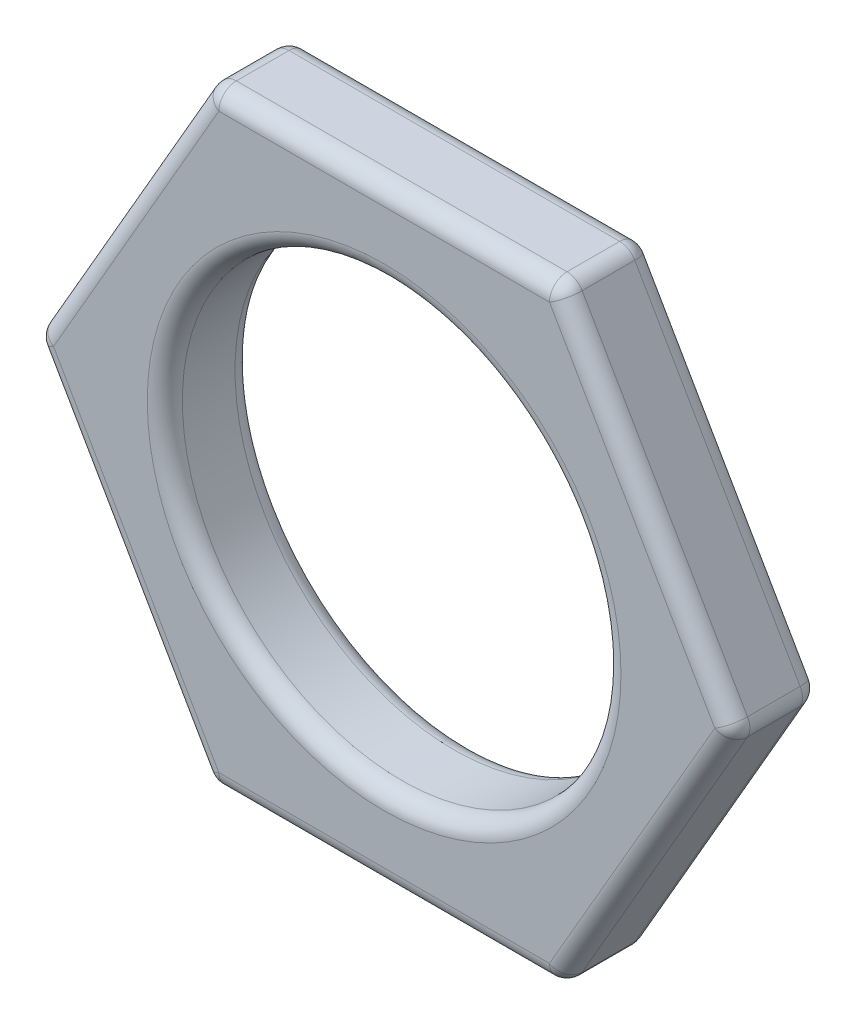
ISO-10303-21;
HEADER;
FILE_DESCRIPTION(('STEP AP214'),'2;1');
FILE_NAME('part.step','',(''),(''),'','','');
FILE_SCHEMA(('AUTOMOTIVE_DESIGN { 1 0 10303 214 1 1 1 1 }'));
ENDSEC;
DATA;
#1=APPLICATION_CONTEXT('core data for automotive mechanical design processes');
#2=APPLICATION_PROTOCOL_DEFINITION('international standard','automotive_design',2000,#1);
#3=PRODUCT_CONTEXT('',#1,'mechanical');
#4=PRODUCT('Part','Part','',(#3));
#5=PRODUCT_RELATED_PRODUCT_CATEGORY('part','',(#4));
#6=PRODUCT_DEFINITION_FORMATION('','',#4);
#7=PRODUCT_DEFINITION_CONTEXT('part definition',#1,'design');
#8=PRODUCT_DEFINITION('design','',#6,#7);
#9=PRODUCT_DEFINITION_SHAPE('','',#8);
#10=(LENGTH_UNIT() NAMED_UNIT(*) SI_UNIT(.MILLI.,.METRE.));
#11=(NAMED_UNIT(*) PLANE_ANGLE_UNIT() SI_UNIT($,.RADIAN.));
#12=(NAMED_UNIT(*) SI_UNIT($,.STERADIAN.) SOLID_ANGLE_UNIT());
#13=UNCERTAINTY_MEASURE_WITH_UNIT(LENGTH_MEASURE(1.E-05),#10,'distance_accuracy_value','');
#14=(GEOMETRIC_REPRESENTATION_CONTEXT(3) GLOBAL_UNCERTAINTY_ASSIGNED_CONTEXT((#13)) GLOBAL_UNIT_ASSIGNED_CONTEXT((#10,
#11,#12)) REPRESENTATION_CONTEXT('',''));
#15=CARTESIAN_POINT('',(0.,0.,0.));
#16=DIRECTION('',(0.,0.,1.));
#17=DIRECTION('',(1.,0.,0.));
#18=AXIS2_PLACEMENT_3D('',#15,#16,#17);
#19=CARTESIAN_POINT('',(9.525,5.4992613140312,1.5875));
#20=DIRECTION('',(0.,0.,1.));
#21=DIRECTION('',(1.,0.,0.));
#22=AXIS2_PLACEMENT_3D('',#19,#20,#21);
#23=PLANE('',#22);
#24=CARTESIAN_POINT('',(0.,0.,1.5875));
#25=DIRECTION('',(0.,0.,1.));
#26=DIRECTION('',(1.,0.,0.));
#27=AXIS2_PLACEMENT_3D('',#24,#25,#26);
#28=CIRCLE('',#27,4.28625);
#29=CARTESIAN_POINT('',(4.28625,0.,1.5875));
#30=VERTEX_POINT('',#29);
#31=EDGE_CURVE('E11',#30,#30,#28,.F.);
#32=ORIENTED_EDGE('',*,*,#31,.T.);
#33=EDGE_LOOP('',(#32));
#34=FACE_BOUND('',#33,.T.);
#35=DIRECTION('',(0.500000000000001,-0.866025403784438,0.));
#36=VECTOR('',#35,1.);
#37=CARTESIAN_POINT('',(-2.90003693429844,-5.34051131403119,1.5875));
#38=LINE('',#37,#36);
#39=CARTESIAN_POINT('',(-5.9833825790646,0.,1.5875));
#40=VERTEX_POINT('',#39);
#41=CARTESIAN_POINT('',(-2.99169128953229,-5.18176131403119,1.5875));
#42=VERTEX_POINT('',#41);
#43=EDGE_CURVE('E53',#40,#42,#38,.T.);
#44=ORIENTED_EDGE('',*,*,#43,.T.);
#45=DIRECTION('',(1.,0.,0.));
#46=VECTOR('',#45,1.);
#47=CARTESIAN_POINT('',(3.17500000000001,-5.18176131403119,1.5875));
#48=LINE('',#47,#46);
#49=CARTESIAN_POINT('',(2.9916912895323,-5.18176131403119,1.5875));
#50=VERTEX_POINT('',#49);
#51=EDGE_CURVE('E45',#42,#50,#48,.T.);
#52=ORIENTED_EDGE('',*,*,#51,.T.);
#53=DIRECTION('',(0.499999999999999,0.866025403784439,0.));
#54=VECTOR('',#53,1.);
#55=CARTESIAN_POINT('',(6.07503693429845,0.158750000000013,1.5875));
#56=LINE('',#55,#54);
#57=CARTESIAN_POINT('',(5.9833825790646,0.,1.5875));
#58=VERTEX_POINT('',#57);
#59=EDGE_CURVE('E271',#50,#58,#56,.T.);
#60=ORIENTED_EDGE('',*,*,#59,.T.);
#61=DIRECTION('',(-0.500000000000002,0.866025403784438,0.));
#62=VECTOR('',#61,1.);
#63=CARTESIAN_POINT('',(2.90003693429844,5.3405113140312,1.5875));
#64=LINE('',#63,#62);
#65=CARTESIAN_POINT('',(2.99169128953229,5.1817613140312,1.5875));
#66=VERTEX_POINT('',#65);
#67=EDGE_CURVE('E273',#58,#66,#64,.T.);
#68=ORIENTED_EDGE('',*,*,#67,.T.);
#69=DIRECTION('',(-1.,0.,0.));
#70=VECTOR('',#69,1.);
#71=CARTESIAN_POINT('',(-3.175,5.1817613140312,1.5875));
#72=LINE('',#71,#70);
#73=CARTESIAN_POINT('',(-2.9916912895323,5.1817613140312,1.5875));
#74=VERTEX_POINT('',#73);
#75=EDGE_CURVE('E275',#66,#74,#72,.T.);
#76=ORIENTED_EDGE('',*,*,#75,.T.);
#77=DIRECTION('',(-0.500000000000001,-0.866025403784438,0.));
#78=VECTOR('',#77,1.);
#79=CARTESIAN_POINT('',(-6.07503693429845,-0.158749999999994,1.5875));
#80=LINE('',#79,#78);
#81=EDGE_CURVE('E58',#74,#40,#80,.T.);
#82=ORIENTED_EDGE('',*,*,#81,.T.);
#83=EDGE_LOOP('',(#44,#52,#60,#68,#76,#82));
#84=FACE_BOUND('',#83,.T.);
#85=ADVANCED_FACE('F36',(#34,#84),#23,.T.);
#86=CARTESIAN_POINT('',(9.525,5.4992613140312,0.));
#87=DIRECTION('',(0.,0.,1.));
#88=DIRECTION('',(1.,0.,0.));
#89=AXIS2_PLACEMENT_3D('',#86,#87,#88);
#90=PLANE('',#89);
#91=CARTESIAN_POINT('',(0.,0.,0.));
#92=DIRECTION('',(0.,0.,1.));
#93=DIRECTION('',(1.,0.,0.));
#94=AXIS2_PLACEMENT_3D('',#91,#92,#93);
#95=CIRCLE('',#94,4.28625);
#96=CARTESIAN_POINT('',(4.28625,0.,0.));
#97=VERTEX_POINT('',#96);
#98=EDGE_CURVE('E262',#97,#97,#95,.T.);
#99=ORIENTED_EDGE('',*,*,#98,.T.);
#100=EDGE_LOOP('',(#99));
#101=FACE_BOUND('',#100,.T.);
#102=DIRECTION('',(-1.,0.,0.));
#103=VECTOR('',#102,1.);
#104=CARTESIAN_POINT('',(9.525,5.1817613140312,0.));
#105=LINE('',#104,#103);
#106=CARTESIAN_POINT('',(-2.99169128953229,5.1817613140312,0.));
#107=VERTEX_POINT('',#106);
#108=CARTESIAN_POINT('',(2.99169128953229,5.1817613140312,0.));
#109=VERTEX_POINT('',#108);
#110=EDGE_CURVE('E257',#107,#109,#105,.F.);
#111=ORIENTED_EDGE('',*,*,#110,.T.);
#112=DIRECTION('',(-0.500000000000002,0.866025403784438,0.));
#113=VECTOR('',#112,1.);
#114=CARTESIAN_POINT('',(4.48753693429845,2.5908806570156,0.));
#115=LINE('',#114,#113);
#116=CARTESIAN_POINT('',(5.9833825790646,0.,0.));
#117=VERTEX_POINT('',#116);
#118=EDGE_CURVE('E259',#109,#117,#115,.F.);
#119=ORIENTED_EDGE('',*,*,#118,.T.);
#120=DIRECTION('',(0.499999999999999,0.866025403784439,0.));
#121=VECTOR('',#120,1.);
#122=CARTESIAN_POINT('',(9.25003693429844,5.65801131403119,0.));
#123=LINE('',#122,#121);
#124=CARTESIAN_POINT('',(2.9916912895323,-5.18176131403119,0.));
#125=VERTEX_POINT('',#124);
#126=EDGE_CURVE('E249',#117,#125,#123,.F.);
#127=ORIENTED_EDGE('',*,*,#126,.T.);
#128=DIRECTION('',(1.,0.,0.));
#129=VECTOR('',#128,1.);
#130=CARTESIAN_POINT('',(9.525,-5.18176131403119,0.));
#131=LINE('',#130,#129);
#132=CARTESIAN_POINT('',(-2.99169128953229,-5.18176131403119,0.));
#133=VERTEX_POINT('',#132);
#134=EDGE_CURVE('E251',#125,#133,#131,.F.);
#135=ORIENTED_EDGE('',*,*,#134,.T.);
#136=DIRECTION('',(0.500000000000001,-0.866025403784438,0.));
#137=VECTOR('',#136,1.);
#138=CARTESIAN_POINT('',(-4.48753693429844,-2.5908806570156,0.));
#139=LINE('',#138,#137);
#140=CARTESIAN_POINT('',(-5.9833825790646,0.,0.));
#141=VERTEX_POINT('',#140);
#142=EDGE_CURVE('E253',#133,#141,#139,.F.);
#143=ORIENTED_EDGE('',*,*,#142,.T.);
#144=DIRECTION('',(-0.500000000000001,-0.866025403784438,0.));
#145=VECTOR('',#144,1.);
#146=CARTESIAN_POINT('',(0.274963065701565,10.8397726280624,0.));
#147=LINE('',#146,#145);
#148=EDGE_CURVE('E255',#141,#107,#147,.F.);
#149=ORIENTED_EDGE('',*,*,#148,.T.);
#150=EDGE_LOOP('',(#111,#119,#127,#135,#143,#149));
#151=FACE_BOUND('',#150,.T.);
#152=ADVANCED_FACE('F378',(#101,#151),#90,.F.);
#153=CARTESIAN_POINT('',(3.17500000000001,-5.49926131403119,1.5875));
#154=DIRECTION('',(-0.866025403784439,0.499999999999999,0.));
#155=DIRECTION('',(-0.499999999999999,-0.866025403784439,0.));
#156=AXIS2_PLACEMENT_3D('',#153,#154,#155);
#157=PLANE('',#156);
#158=DIRECTION('',(0.,0.,-1.));
#159=VECTOR('',#158,1.);
#160=CARTESIAN_POINT('',(3.26665435523386,-5.34051131403119,1.5875));
#161=LINE('',#160,#159);
#162=CARTESIAN_POINT('',(3.26665435523386,-5.34051131403119,1.27));
#163=VERTEX_POINT('',#162);
#164=CARTESIAN_POINT('',(3.26665435523386,-5.34051131403119,0.3175));
#165=VERTEX_POINT('',#164);
#166=EDGE_CURVE('E174',#163,#165,#161,.T.);
#167=ORIENTED_EDGE('',*,*,#166,.T.);
#168=DIRECTION('',(0.499999999999999,0.866025403784439,0.));
#169=VECTOR('',#168,1.);
#170=CARTESIAN_POINT('',(3.17500000000001,-5.49926131403119,0.3175));
#171=LINE('',#170,#169);
#172=CARTESIAN_POINT('',(6.25834564476615,-0.158749999999987,0.3175));
#173=VERTEX_POINT('',#172);
#174=EDGE_CURVE('E170',#165,#173,#171,.T.);
#175=ORIENTED_EDGE('',*,*,#174,.T.);
#176=DIRECTION('',(0.,0.,-1.));
#177=VECTOR('',#176,1.);
#178=CARTESIAN_POINT('',(6.25834564476616,-0.158749999999987,1.5875));
#179=LINE('',#178,#177);
#180=CARTESIAN_POINT('',(6.25834564476615,-0.158749999999987,1.27));
#181=VERTEX_POINT('',#180);
#182=EDGE_CURVE('E162',#173,#181,#179,.F.);
#183=ORIENTED_EDGE('',*,*,#182,.T.);
#184=DIRECTION('',(0.499999999999999,0.866025403784439,0.));
#185=VECTOR('',#184,1.);
#186=CARTESIAN_POINT('',(3.17500000000001,-5.49926131403119,1.27));
#187=LINE('',#186,#185);
#188=EDGE_CURVE('E167',#181,#163,#187,.F.);
#189=ORIENTED_EDGE('',*,*,#188,.T.);
#190=EDGE_LOOP('',(#167,#175,#183,#189));
#191=FACE_BOUND('',#190,.T.);
#192=ADVANCED_FACE('F165',(#191),#157,.F.);
#193=CARTESIAN_POINT('',(6.35000000000001,0.,1.5875));
#194=DIRECTION('',(-0.866025403784438,-0.500000000000002,0.));
#195=DIRECTION('',(0.500000000000002,-0.866025403784438,0.));
#196=AXIS2_PLACEMENT_3D('',#193,#194,#195);
#197=PLANE('',#196);
#198=DIRECTION('',(0.,0.,-1.));
#199=VECTOR('',#198,1.);
#200=CARTESIAN_POINT('',(6.25834564476615,0.158750000000013,1.5875));
#201=LINE('',#200,#199);
#202=CARTESIAN_POINT('',(6.25834564476615,0.158750000000013,1.27));
#203=VERTEX_POINT('',#202);
#204=CARTESIAN_POINT('',(6.25834564476615,0.158750000000013,0.3175));
#205=VERTEX_POINT('',#204);
#206=EDGE_CURVE('E182',#203,#205,#201,.T.);
#207=ORIENTED_EDGE('',*,*,#206,.T.);
#208=DIRECTION('',(-0.500000000000002,0.866025403784438,0.));
#209=VECTOR('',#208,1.);
#210=CARTESIAN_POINT('',(6.35000000000001,0.,0.3175));
#211=LINE('',#210,#209);
#212=CARTESIAN_POINT('',(3.26665435523385,5.3405113140312,0.3175));
#213=VERTEX_POINT('',#212);
#214=EDGE_CURVE('E220',#205,#213,#211,.T.);
#215=ORIENTED_EDGE('',*,*,#214,.T.);
#216=DIRECTION('',(0.,0.,-1.));
#217=VECTOR('',#216,1.);
#218=CARTESIAN_POINT('',(3.26665435523385,5.3405113140312,1.5875));
#219=LINE('',#218,#217);
#220=CARTESIAN_POINT('',(3.26665435523385,5.3405113140312,1.27));
#221=VERTEX_POINT('',#220);
#222=EDGE_CURVE('E217',#213,#221,#219,.F.);
#223=ORIENTED_EDGE('',*,*,#222,.T.);
#224=DIRECTION('',(-0.500000000000002,0.866025403784438,0.));
#225=VECTOR('',#224,1.);
#226=CARTESIAN_POINT('',(6.35000000000001,0.,1.27));
#227=LINE('',#226,#225);
#228=EDGE_CURVE('E215',#221,#203,#227,.F.);
#229=ORIENTED_EDGE('',*,*,#228,.T.);
#230=EDGE_LOOP('',(#207,#215,#223,#229));
#231=FACE_BOUND('',#230,.T.);
#232=ADVANCED_FACE('F483',(#231),#197,.F.);
#233=CARTESIAN_POINT('',(3.175,5.4992613140312,1.5875));
#234=DIRECTION('',(0.,-1.,0.));
#235=DIRECTION('',(0.,0.,-1.));
#236=AXIS2_PLACEMENT_3D('',#233,#234,#235);
#237=PLANE('',#236);
#238=DIRECTION('',(0.,0.,-1.));
#239=VECTOR('',#238,1.);
#240=CARTESIAN_POINT('',(2.99169128953229,5.4992613140312,1.5875));
#241=LINE('',#240,#239);
#242=CARTESIAN_POINT('',(2.99169128953229,5.4992613140312,1.27));
#243=VERTEX_POINT('',#242);
#244=CARTESIAN_POINT('',(2.99169128953229,5.4992613140312,0.3175));
#245=VERTEX_POINT('',#244);
#246=EDGE_CURVE('E226',#243,#245,#241,.T.);
#247=ORIENTED_EDGE('',*,*,#246,.T.);
#248=DIRECTION('',(-1.,0.,0.));
#249=VECTOR('',#248,1.);
#250=CARTESIAN_POINT('',(3.175,5.4992613140312,0.3175));
#251=LINE('',#250,#249);
#252=CARTESIAN_POINT('',(-2.99169128953229,5.4992613140312,0.3175));
#253=VERTEX_POINT('',#252);
#254=EDGE_CURVE('E229',#245,#253,#251,.T.);
#255=ORIENTED_EDGE('',*,*,#254,.T.);
#256=DIRECTION('',(0.,0.,-1.));
#257=VECTOR('',#256,1.);
#258=CARTESIAN_POINT('',(-2.9916912895323,5.4992613140312,1.5875));
#259=LINE('',#258,#257);
#260=CARTESIAN_POINT('',(-2.99169128953229,5.4992613140312,1.27));
#261=VERTEX_POINT('',#260);
#262=EDGE_CURVE('E224',#253,#261,#259,.F.);
#263=ORIENTED_EDGE('',*,*,#262,.T.);
#264=DIRECTION('',(-1.,0.,0.));
#265=VECTOR('',#264,1.);
#266=CARTESIAN_POINT('',(3.175,5.4992613140312,1.27));
#267=LINE('',#266,#265);
#268=EDGE_CURVE('E222',#261,#243,#267,.F.);
#269=ORIENTED_EDGE('',*,*,#268,.T.);
#270=EDGE_LOOP('',(#247,#255,#263,#269));
#271=FACE_BOUND('',#270,.T.);
#272=ADVANCED_FACE('F413',(#271),#237,.F.);
#273=CARTESIAN_POINT('',(-3.175,5.4992613140312,1.5875));
#274=DIRECTION('',(0.866025403784438,-0.500000000000001,0.));
#275=DIRECTION('',(0.500000000000001,0.866025403784438,0.));
#276=AXIS2_PLACEMENT_3D('',#273,#274,#275);
#277=PLANE('',#276);
#278=DIRECTION('',(0.,0.,-1.));
#279=VECTOR('',#278,1.);
#280=CARTESIAN_POINT('',(-3.26665435523385,5.3405113140312,1.5875));
#281=LINE('',#280,#279);
#282=CARTESIAN_POINT('',(-3.26665435523385,5.3405113140312,1.27));
#283=VERTEX_POINT('',#282);
#284=CARTESIAN_POINT('',(-3.26665435523385,5.3405113140312,0.3175));
#285=VERTEX_POINT('',#284);
#286=EDGE_CURVE('E244',#283,#285,#281,.T.);
#287=ORIENTED_EDGE('',*,*,#286,.T.);
#288=DIRECTION('',(-0.500000000000001,-0.866025403784438,0.));
#289=VECTOR('',#288,1.);
#290=CARTESIAN_POINT('',(-3.175,5.4992613140312,0.3175));
#291=LINE('',#290,#289);
#292=CARTESIAN_POINT('',(-6.25834564476616,0.158750000000006,0.3175));
#293=VERTEX_POINT('',#292);
#294=EDGE_CURVE('E247',#285,#293,#291,.T.);
#295=ORIENTED_EDGE('',*,*,#294,.T.);
#296=DIRECTION('',(0.,0.,-1.));
#297=VECTOR('',#296,1.);
#298=CARTESIAN_POINT('',(-6.25834564476616,0.158750000000006,1.5875));
#299=LINE('',#298,#297);
#300=CARTESIAN_POINT('',(-6.25834564476616,0.158750000000006,1.27));
#301=VERTEX_POINT('',#300);
#302=EDGE_CURVE('E242',#293,#301,#299,.F.);
#303=ORIENTED_EDGE('',*,*,#302,.T.);
#304=DIRECTION('',(-0.500000000000001,-0.866025403784438,0.));
#305=VECTOR('',#304,1.);
#306=CARTESIAN_POINT('',(-3.175,5.4992613140312,1.27));
#307=LINE('',#306,#305);
#308=EDGE_CURVE('E240',#301,#283,#307,.F.);
#309=ORIENTED_EDGE('',*,*,#308,.T.);
#310=EDGE_LOOP('',(#287,#295,#303,#309));
#311=FACE_BOUND('',#310,.T.);
#312=ADVANCED_FACE('F387',(#311),#277,.F.);
#313=CARTESIAN_POINT('',(-6.35000000000001,0.,1.5875));
#314=DIRECTION('',(0.866025403784438,0.500000000000001,0.));
#315=DIRECTION('',(-0.500000000000001,0.866025403784438,0.));
#316=AXIS2_PLACEMENT_3D('',#313,#314,#315);
#317=PLANE('',#316);
#318=DIRECTION('',(0.,0.,-1.));
#319=VECTOR('',#318,1.);
#320=CARTESIAN_POINT('',(-6.25834564476616,-0.158749999999993,1.5875));
#321=LINE('',#320,#319);
#322=CARTESIAN_POINT('',(-6.25834564476616,-0.158749999999993,1.27));
#323=VERTEX_POINT('',#322);
#324=CARTESIAN_POINT('',(-6.25834564476616,-0.158749999999993,0.3175));
#325=VERTEX_POINT('',#324);
#326=EDGE_CURVE('E233',#323,#325,#321,.T.);
#327=ORIENTED_EDGE('',*,*,#326,.T.);
#328=DIRECTION('',(0.500000000000001,-0.866025403784438,0.));
#329=VECTOR('',#328,1.);
#330=CARTESIAN_POINT('',(-6.35000000000001,0.,0.3175));
#331=LINE('',#330,#329);
#332=CARTESIAN_POINT('',(-3.26665435523385,-5.34051131403119,0.3175));
#333=VERTEX_POINT('',#332);
#334=EDGE_CURVE('E238',#325,#333,#331,.T.);
#335=ORIENTED_EDGE('',*,*,#334,.T.);
#336=DIRECTION('',(0.,0.,-1.));
#337=VECTOR('',#336,1.);
#338=CARTESIAN_POINT('',(-3.26665435523385,-5.34051131403119,1.5875));
#339=LINE('',#338,#337);
#340=CARTESIAN_POINT('',(-3.26665435523385,-5.34051131403119,1.27));
#341=VERTEX_POINT('',#340);
#342=EDGE_CURVE('E235',#333,#341,#339,.F.);
#343=ORIENTED_EDGE('',*,*,#342,.T.);
#344=DIRECTION('',(0.500000000000001,-0.866025403784438,0.));
#345=VECTOR('',#344,1.);
#346=CARTESIAN_POINT('',(-6.35000000000001,0.,1.27));
#347=LINE('',#346,#345);
#348=EDGE_CURVE('E231',#341,#323,#347,.F.);
#349=ORIENTED_EDGE('',*,*,#348,.T.);
#350=EDGE_LOOP('',(#327,#335,#343,#349));
#351=FACE_BOUND('',#350,.T.);
#352=ADVANCED_FACE('F474',(#351),#317,.F.);
#353=CARTESIAN_POINT('',(-3.175,-5.49926131403119,1.5875));
#354=DIRECTION('',(0.,1.,0.));
#355=DIRECTION('',(0.,0.,1.));
#356=AXIS2_PLACEMENT_3D('',#353,#354,#355);
#357=PLANE('',#356);
#358=DIRECTION('',(0.,0.,-1.));
#359=VECTOR('',#358,1.);
#360=CARTESIAN_POINT('',(-2.99169128953229,-5.49926131403119,1.5875));
#361=LINE('',#360,#359);
#362=CARTESIAN_POINT('',(-2.99169128953229,-5.49926131403119,1.27));
#363=VERTEX_POINT('',#362);
#364=CARTESIAN_POINT('',(-2.99169128953229,-5.49926131403119,0.3175));
#365=VERTEX_POINT('',#364);
#366=EDGE_CURVE('E208',#363,#365,#361,.T.);
#367=ORIENTED_EDGE('',*,*,#366,.T.);
#368=DIRECTION('',(1.,0.,0.));
#369=VECTOR('',#368,1.);
#370=CARTESIAN_POINT('',(-3.175,-5.49926131403119,0.3175));
#371=LINE('',#370,#369);
#372=CARTESIAN_POINT('',(2.9916912895323,-5.49926131403119,0.3175));
#373=VERTEX_POINT('',#372);
#374=EDGE_CURVE('E213',#365,#373,#371,.T.);
#375=ORIENTED_EDGE('',*,*,#374,.T.);
#376=DIRECTION('',(0.,0.,-1.));
#377=VECTOR('',#376,1.);
#378=CARTESIAN_POINT('',(2.9916912895323,-5.49926131403119,1.5875));
#379=LINE('',#378,#377);
#380=CARTESIAN_POINT('',(2.9916912895323,-5.49926131403119,1.27));
#381=VERTEX_POINT('',#380);
#382=EDGE_CURVE('E210',#373,#381,#379,.F.);
#383=ORIENTED_EDGE('',*,*,#382,.T.);
#384=DIRECTION('',(1.,0.,0.));
#385=VECTOR('',#384,1.);
#386=CARTESIAN_POINT('',(-3.175,-5.49926131403119,1.27));
#387=LINE('',#386,#385);
#388=EDGE_CURVE('E206',#381,#363,#387,.F.);
#389=ORIENTED_EDGE('',*,*,#388,.T.);
#390=EDGE_LOOP('',(#367,#375,#383,#389));
#391=FACE_BOUND('',#390,.T.);
#392=ADVANCED_FACE('F471',(#391),#357,.F.);
#393=CARTESIAN_POINT('',(0.,0.,1.5875));
#394=DIRECTION('',(0.,0.,-1.));
#395=DIRECTION('',(-1.,0.,0.));
#396=AXIS2_PLACEMENT_3D('',#393,#394,#395);
#397=CYLINDRICAL_SURFACE('',#396,3.96875);
#398=CARTESIAN_POINT('',(0.,0.,0.3175));
#399=DIRECTION('',(0.,0.,1.));
#400=DIRECTION('',(1.,0.,0.));
#401=AXIS2_PLACEMENT_3D('',#398,#399,#400);
#402=CIRCLE('',#401,3.96875);
#403=CARTESIAN_POINT('',(3.96875,0.,0.3175));
#404=VERTEX_POINT('',#403);
#405=EDGE_CURVE('E268',#404,#404,#402,.F.);
#406=ORIENTED_EDGE('',*,*,#405,.T.);
#407=EDGE_LOOP('',(#406));
#408=FACE_BOUND('',#407,.T.);
#409=CARTESIAN_POINT('',(0.,0.,1.27));
#410=DIRECTION('',(0.,0.,1.));
#411=DIRECTION('',(1.,0.,0.));
#412=AXIS2_PLACEMENT_3D('',#409,#410,#411);
#413=CIRCLE('',#412,3.96875);
#414=CARTESIAN_POINT('',(3.96875,0.,1.27));
#415=VERTEX_POINT('',#414);
#416=EDGE_CURVE('E265',#415,#415,#413,.T.);
#417=ORIENTED_EDGE('',*,*,#416,.T.);
#418=EDGE_LOOP('',(#417));
#419=FACE_BOUND('',#418,.T.);
#420=ADVANCED_FACE('F469',(#408,#419),#397,.F.);
#421=CARTESIAN_POINT('',(-2.99169128953229,5.1817613140312,1.5875));
#422=DIRECTION('',(0.,0.,-1.));
#423=DIRECTION('',(-1.,0.,0.));
#424=AXIS2_PLACEMENT_3D('',#421,#422,#423);
#425=CYLINDRICAL_SURFACE('',#424,0.3175);
#426=CARTESIAN_POINT('',(-2.99169128953229,5.1817613140312,1.27));
#427=DIRECTION('',(0.,0.,1.));
#428=DIRECTION('',(1.,0.,0.));
#429=AXIS2_PLACEMENT_3D('',#426,#427,#428);
#430=CIRCLE('',#429,0.3175);
#431=EDGE_CURVE('E40',#261,#283,#430,.T.);
#432=ORIENTED_EDGE('',*,*,#431,.F.);
#433=ORIENTED_EDGE('',*,*,#262,.F.);
#434=CARTESIAN_POINT('',(-2.99169128953229,5.1817613140312,0.3175));
#435=DIRECTION('',(0.,0.,-1.));
#436=DIRECTION('',(-1.,0.,0.));
#437=AXIS2_PLACEMENT_3D('',#434,#435,#436);
#438=CIRCLE('',#437,0.3175);
#439=EDGE_CURVE('E202',#285,#253,#438,.T.);
#440=ORIENTED_EDGE('',*,*,#439,.F.);
#441=ORIENTED_EDGE('',*,*,#286,.F.);
#442=EDGE_LOOP('',(#432,#433,#440,#441));
#443=FACE_BOUND('',#442,.T.);
#444=ADVANCED_FACE('F402',(#443),#425,.T.);
#445=CARTESIAN_POINT('',(-2.99169128953229,5.1817613140312,1.27));
#446=DIRECTION('',(0.,0.,1.));
#447=DIRECTION('',(1.,0.,0.));
#448=AXIS2_PLACEMENT_3D('',#445,#446,#447);
#449=SPHERICAL_SURFACE('',#448,0.3175);
#450=CARTESIAN_POINT('',(-2.9916912895323,5.1817613140312,1.27));
#451=DIRECTION('',(-1.,0.,0.));
#452=DIRECTION('',(0.,-1.,0.));
#453=AXIS2_PLACEMENT_3D('',#450,#451,#452);
#454=CIRCLE('',#453,0.3175);
#455=EDGE_CURVE('E357',#261,#74,#454,.F.);
#456=ORIENTED_EDGE('',*,*,#455,.F.);
#457=ORIENTED_EDGE('',*,*,#431,.T.);
#458=CARTESIAN_POINT('',(-2.99169128953229,5.1817613140312,1.27));
#459=DIRECTION('',(0.5,0.866025403784439,0.));
#460=DIRECTION('',(-0.866025403784439,0.5,0.));
#461=AXIS2_PLACEMENT_3D('',#458,#459,#460);
#462=CIRCLE('',#461,0.3175);
#463=EDGE_CURVE('E360',#74,#283,#462,.F.);
#464=ORIENTED_EDGE('',*,*,#463,.F.);
#465=EDGE_LOOP('',(#456,#457,#464));
#466=FACE_BOUND('',#465,.T.);
#467=ADVANCED_FACE('F405',(#466),#449,.T.);
#468=CARTESIAN_POINT('',(-2.99169128953229,5.1817613140312,0.3175));
#469=DIRECTION('',(0.,0.,1.));
#470=DIRECTION('',(1.,0.,0.));
#471=AXIS2_PLACEMENT_3D('',#468,#469,#470);
#472=SPHERICAL_SURFACE('',#471,0.3175);
#473=CARTESIAN_POINT('',(-2.99169128953229,5.1817613140312,0.3175));
#474=DIRECTION('',(0.5,0.866025403784439,0.));
#475=DIRECTION('',(-0.866025403784439,0.5,0.));
#476=AXIS2_PLACEMENT_3D('',#473,#474,#475);
#477=CIRCLE('',#476,0.3175);
#478=EDGE_CURVE('E351',#285,#107,#477,.F.);
#479=ORIENTED_EDGE('',*,*,#478,.F.);
#480=ORIENTED_EDGE('',*,*,#439,.T.);
#481=CARTESIAN_POINT('',(-2.99169128953229,5.1817613140312,0.3175));
#482=DIRECTION('',(-1.,0.,0.));
#483=DIRECTION('',(0.,0.,1.));
#484=AXIS2_PLACEMENT_3D('',#481,#482,#483);
#485=CIRCLE('',#484,0.3175);
#486=EDGE_CURVE('E354',#107,#253,#485,.F.);
#487=ORIENTED_EDGE('',*,*,#486,.F.);
#488=EDGE_LOOP('',(#479,#480,#487));
#489=FACE_BOUND('',#488,.T.);
#490=ADVANCED_FACE('F367',(#489),#472,.T.);
#491=CARTESIAN_POINT('',(0.274963065701565,10.8397726280624,1.27));
#492=DIRECTION('',(0.500000000000001,0.866025403784438,0.));
#493=DIRECTION('',(-0.866025403784438,0.500000000000001,0.));
#494=AXIS2_PLACEMENT_3D('',#491,#492,#493);
#495=CYLINDRICAL_SURFACE('',#494,0.3175);
#496=ORIENTED_EDGE('',*,*,#463,.T.);
#497=ORIENTED_EDGE('',*,*,#308,.F.);
#498=CARTESIAN_POINT('',(-5.9833825790646,0.,1.27));
#499=DIRECTION('',(-0.499999999999995,-0.866025403784441,0.));
#500=DIRECTION('',(0.866025403784441,-0.499999999999995,0.));
#501=AXIS2_PLACEMENT_3D('',#498,#499,#500);
#502=CIRCLE('',#501,0.3175);
#503=EDGE_CURVE('E345',#40,#301,#502,.T.);
#504=ORIENTED_EDGE('',*,*,#503,.F.);
#505=ORIENTED_EDGE('',*,*,#81,.F.);
#506=EDGE_LOOP('',(#496,#497,#504,#505));
#507=FACE_BOUND('',#506,.T.);
#508=ADVANCED_FACE('F399',(#507),#495,.T.);
#509=CARTESIAN_POINT('',(9.525,5.1817613140312,1.27));
#510=DIRECTION('',(1.,0.,0.));
#511=DIRECTION('',(0.,0.,-1.));
#512=AXIS2_PLACEMENT_3D('',#509,#510,#511);
#513=CYLINDRICAL_SURFACE('',#512,0.3175);
#514=ORIENTED_EDGE('',*,*,#455,.T.);
#515=ORIENTED_EDGE('',*,*,#75,.F.);
#516=CARTESIAN_POINT('',(2.99169128953229,5.1817613140312,1.27));
#517=DIRECTION('',(1.,0.,0.));
#518=DIRECTION('',(0.,0.,-1.));
#519=AXIS2_PLACEMENT_3D('',#516,#517,#518);
#520=CIRCLE('',#519,0.3175);
#521=EDGE_CURVE('E342',#243,#66,#520,.T.);
#522=ORIENTED_EDGE('',*,*,#521,.F.);
#523=ORIENTED_EDGE('',*,*,#268,.F.);
#524=EDGE_LOOP('',(#514,#515,#522,#523));
#525=FACE_BOUND('',#524,.T.);
#526=ADVANCED_FACE('F410',(#525),#513,.T.);
#527=CARTESIAN_POINT('',(2.99169128953229,5.1817613140312,1.5875));
#528=DIRECTION('',(0.,0.,-1.));
#529=DIRECTION('',(-1.,0.,0.));
#530=AXIS2_PLACEMENT_3D('',#527,#528,#529);
#531=CYLINDRICAL_SURFACE('',#530,0.3175);
#532=CARTESIAN_POINT('',(2.99169128953229,5.1817613140312,0.3175));
#533=DIRECTION('',(0.,0.,-1.));
#534=DIRECTION('',(-1.,0.,0.));
#535=AXIS2_PLACEMENT_3D('',#532,#533,#534);
#536=CIRCLE('',#535,0.3175);
#537=EDGE_CURVE('E336',#245,#213,#536,.T.);
#538=ORIENTED_EDGE('',*,*,#537,.F.);
#539=ORIENTED_EDGE('',*,*,#246,.F.);
#540=CARTESIAN_POINT('',(2.99169128953229,5.1817613140312,1.27));
#541=DIRECTION('',(0.,0.,1.));
#542=DIRECTION('',(1.,0.,0.));
#543=AXIS2_PLACEMENT_3D('',#540,#541,#542);
#544=CIRCLE('',#543,0.3175);
#545=EDGE_CURVE('E339',#221,#243,#544,.T.);
#546=ORIENTED_EDGE('',*,*,#545,.F.);
#547=ORIENTED_EDGE('',*,*,#222,.F.);
#548=EDGE_LOOP('',(#538,#539,#546,#547));
#549=FACE_BOUND('',#548,.T.);
#550=ADVANCED_FACE('F417',(#549),#531,.T.);
#551=CARTESIAN_POINT('',(3.175,5.1817613140312,0.3175));
#552=DIRECTION('',(-1.,0.,0.));
#553=DIRECTION('',(0.,0.,1.));
#554=AXIS2_PLACEMENT_3D('',#551,#552,#553);
#555=CYLINDRICAL_SURFACE('',#554,0.3175);
#556=ORIENTED_EDGE('',*,*,#486,.T.);
#557=ORIENTED_EDGE('',*,*,#254,.F.);
#558=CARTESIAN_POINT('',(2.99169128953229,5.1817613140312,0.3175));
#559=DIRECTION('',(1.,0.,0.));
#560=DIRECTION('',(0.,0.,-1.));
#561=AXIS2_PLACEMENT_3D('',#558,#559,#560);
#562=CIRCLE('',#561,0.3175);
#563=EDGE_CURVE('E334',#109,#245,#562,.T.);
#564=ORIENTED_EDGE('',*,*,#563,.F.);
#565=ORIENTED_EDGE('',*,*,#110,.F.);
#566=EDGE_LOOP('',(#556,#557,#564,#565));
#567=FACE_BOUND('',#566,.T.);
#568=ADVANCED_FACE('F374',(#567),#555,.T.);
#569=CARTESIAN_POINT('',(-2.90003693429844,5.3405113140312,0.3175));
#570=DIRECTION('',(-0.500000000000001,-0.866025403784438,0.));
#571=DIRECTION('',(0.866025403784438,-0.500000000000001,0.));
#572=AXIS2_PLACEMENT_3D('',#569,#570,#571);
#573=CYLINDRICAL_SURFACE('',#572,0.3175);
#574=ORIENTED_EDGE('',*,*,#478,.T.);
#575=ORIENTED_EDGE('',*,*,#148,.F.);
#576=CARTESIAN_POINT('',(-5.9833825790646,0.,0.3175));
#577=DIRECTION('',(-0.500000000000001,-0.866025403784438,0.));
#578=DIRECTION('',(0.866025403784438,-0.500000000000001,0.));
#579=AXIS2_PLACEMENT_3D('',#576,#577,#578);
#580=CIRCLE('',#579,0.3175);
#581=EDGE_CURVE('E331',#293,#141,#580,.T.);
#582=ORIENTED_EDGE('',*,*,#581,.F.);
#583=ORIENTED_EDGE('',*,*,#294,.F.);
#584=EDGE_LOOP('',(#574,#575,#582,#583));
#585=FACE_BOUND('',#584,.T.);
#586=ADVANCED_FACE('F384',(#585),#573,.T.);
#587=CARTESIAN_POINT('',(-5.9833825790646,0.,1.5875));
#588=DIRECTION('',(0.,0.,-1.));
#589=DIRECTION('',(-1.,0.,0.));
#590=AXIS2_PLACEMENT_3D('',#587,#588,#589);
#591=CYLINDRICAL_SURFACE('',#590,0.3175);
#592=CARTESIAN_POINT('',(-5.9833825790646,0.,1.27));
#593=DIRECTION('',(0.,0.,1.));
#594=DIRECTION('',(1.,0.,0.));
#595=AXIS2_PLACEMENT_3D('',#592,#593,#594);
#596=CIRCLE('',#595,0.3175);
#597=EDGE_CURVE('E348',#301,#323,#596,.T.);
#598=ORIENTED_EDGE('',*,*,#597,.F.);
#599=ORIENTED_EDGE('',*,*,#302,.F.);
#600=CARTESIAN_POINT('',(-5.9833825790646,0.,0.3175));
#601=DIRECTION('',(0.,0.,-1.));
#602=DIRECTION('',(-1.,0.,0.));
#603=AXIS2_PLACEMENT_3D('',#600,#601,#602);
#604=CIRCLE('',#603,0.3175);
#605=EDGE_CURVE('E328',#325,#293,#604,.T.);
#606=ORIENTED_EDGE('',*,*,#605,.F.);
#607=ORIENTED_EDGE('',*,*,#326,.F.);
#608=EDGE_LOOP('',(#598,#599,#606,#607));
#609=FACE_BOUND('',#608,.T.);
#610=ADVANCED_FACE('F392',(#609),#591,.T.);
#611=CARTESIAN_POINT('',(-5.9833825790646,0.,1.27));
#612=DIRECTION('',(0.,0.,1.));
#613=DIRECTION('',(1.,0.,0.));
#614=AXIS2_PLACEMENT_3D('',#611,#612,#613);
#615=SPHERICAL_SURFACE('',#614,0.3175);
#616=ORIENTED_EDGE('',*,*,#503,.T.);
#617=ORIENTED_EDGE('',*,*,#597,.T.);
#618=CARTESIAN_POINT('',(-5.9833825790646,0.,1.27));
#619=DIRECTION('',(-0.500000000000001,0.866025403784438,0.));
#620=DIRECTION('',(-0.866025403784438,-0.500000000000001,0.));
#621=AXIS2_PLACEMENT_3D('',#618,#619,#620);
#622=CIRCLE('',#621,0.3175);
#623=EDGE_CURVE('E325',#40,#323,#622,.F.);
#624=ORIENTED_EDGE('',*,*,#623,.F.);
#625=EDGE_LOOP('',(#616,#617,#624));
#626=FACE_BOUND('',#625,.T.);
#627=ADVANCED_FACE('F397',(#626),#615,.T.);
#628=CARTESIAN_POINT('',(2.99169128953229,5.1817613140312,1.27));
#629=DIRECTION('',(0.,0.,1.));
#630=DIRECTION('',(1.,0.,0.));
#631=AXIS2_PLACEMENT_3D('',#628,#629,#630);
#632=SPHERICAL_SURFACE('',#631,0.3175);
#633=ORIENTED_EDGE('',*,*,#545,.T.);
#634=ORIENTED_EDGE('',*,*,#521,.T.);
#635=CARTESIAN_POINT('',(2.99169128953229,5.1817613140312,1.27));
#636=DIRECTION('',(-0.500000000000003,0.866025403784437,0.));
#637=DIRECTION('',(-0.866025403784437,-0.500000000000003,0.));
#638=AXIS2_PLACEMENT_3D('',#635,#636,#637);
#639=CIRCLE('',#638,0.3175);
#640=EDGE_CURVE('E322',#221,#66,#639,.F.);
#641=ORIENTED_EDGE('',*,*,#640,.F.);
#642=EDGE_LOOP('',(#633,#634,#641));
#643=FACE_BOUND('',#642,.T.);
#644=ADVANCED_FACE('F458',(#643),#632,.T.);
#645=CARTESIAN_POINT('',(2.99169128953229,5.1817613140312,0.3175));
#646=DIRECTION('',(0.,0.,1.));
#647=DIRECTION('',(1.,0.,0.));
#648=AXIS2_PLACEMENT_3D('',#645,#646,#647);
#649=SPHERICAL_SURFACE('',#648,0.3175);
#650=ORIENTED_EDGE('',*,*,#563,.T.);
#651=ORIENTED_EDGE('',*,*,#537,.T.);
#652=CARTESIAN_POINT('',(2.99169128953229,5.1817613140312,0.3175));
#653=DIRECTION('',(-0.500000000000002,0.866025403784437,0.));
#654=DIRECTION('',(-0.866025403784437,-0.500000000000002,0.));
#655=AXIS2_PLACEMENT_3D('',#652,#653,#654);
#656=CIRCLE('',#655,0.3175);
#657=EDGE_CURVE('E319',#109,#213,#656,.F.);
#658=ORIENTED_EDGE('',*,*,#657,.F.);
#659=EDGE_LOOP('',(#650,#651,#658));
#660=FACE_BOUND('',#659,.T.);
#661=ADVANCED_FACE('F421',(#660),#649,.T.);
#662=CARTESIAN_POINT('',(-5.9833825790646,0.,0.3175));
#663=DIRECTION('',(0.,0.,1.));
#664=DIRECTION('',(1.,0.,0.));
#665=AXIS2_PLACEMENT_3D('',#662,#663,#664);
#666=SPHERICAL_SURFACE('',#665,0.3175);
#667=ORIENTED_EDGE('',*,*,#605,.T.);
#668=ORIENTED_EDGE('',*,*,#581,.T.);
#669=CARTESIAN_POINT('',(-5.9833825790646,0.,0.3175));
#670=DIRECTION('',(-0.499999999999997,0.86602540378444,0.));
#671=DIRECTION('',(-0.86602540378444,-0.499999999999997,0.));
#672=AXIS2_PLACEMENT_3D('',#669,#670,#671);
#673=CIRCLE('',#672,0.3175);
#674=EDGE_CURVE('E316',#325,#141,#673,.F.);
#675=ORIENTED_EDGE('',*,*,#674,.F.);
#676=EDGE_LOOP('',(#667,#668,#675));
#677=FACE_BOUND('',#676,.T.);
#678=ADVANCED_FACE('F447',(#677),#666,.T.);
#679=CARTESIAN_POINT('',(-4.48753693429844,-2.5908806570156,1.27));
#680=DIRECTION('',(-0.500000000000001,0.866025403784438,0.));
#681=DIRECTION('',(-0.866025403784438,-0.500000000000001,0.));
#682=AXIS2_PLACEMENT_3D('',#679,#680,#681);
#683=CYLINDRICAL_SURFACE('',#682,0.3175);
#684=ORIENTED_EDGE('',*,*,#623,.T.);
#685=ORIENTED_EDGE('',*,*,#348,.F.);
#686=CARTESIAN_POINT('',(-2.99169128953229,-5.18176131403119,1.27));
#687=DIRECTION('',(0.499999999999999,-0.866025403784439,0.));
#688=DIRECTION('',(0.866025403784439,0.499999999999999,0.));
#689=AXIS2_PLACEMENT_3D('',#686,#687,#688);
#690=CIRCLE('',#689,0.3175);
#691=EDGE_CURVE('E311',#42,#341,#690,.T.);
#692=ORIENTED_EDGE('',*,*,#691,.F.);
#693=ORIENTED_EDGE('',*,*,#43,.F.);
#694=EDGE_LOOP('',(#684,#685,#692,#693));
#695=FACE_BOUND('',#694,.T.);
#696=ADVANCED_FACE('F449',(#695),#683,.T.);
#697=CARTESIAN_POINT('',(4.48753693429845,2.5908806570156,1.27));
#698=DIRECTION('',(0.500000000000002,-0.866025403784438,0.));
#699=DIRECTION('',(0.866025403784438,0.500000000000002,0.));
#700=AXIS2_PLACEMENT_3D('',#697,#698,#699);
#701=CYLINDRICAL_SURFACE('',#700,0.3175);
#702=ORIENTED_EDGE('',*,*,#640,.T.);
#703=ORIENTED_EDGE('',*,*,#67,.F.);
#704=CARTESIAN_POINT('',(5.9833825790646,0.,1.27));
#705=DIRECTION('',(0.500000000000001,-0.866025403784438,0.));
#706=DIRECTION('',(0.866025403784438,0.500000000000001,0.));
#707=AXIS2_PLACEMENT_3D('',#704,#705,#706);
#708=CIRCLE('',#707,0.3175);
#709=EDGE_CURVE('E186',#203,#58,#708,.T.);
#710=ORIENTED_EDGE('',*,*,#709,.F.);
#711=ORIENTED_EDGE('',*,*,#228,.F.);
#712=EDGE_LOOP('',(#702,#703,#710,#711));
#713=FACE_BOUND('',#712,.T.);
#714=ADVANCED_FACE('F455',(#713),#701,.T.);
#715=CARTESIAN_POINT('',(5.9833825790646,0.,1.5875));
#716=DIRECTION('',(0.,0.,-1.));
#717=DIRECTION('',(-1.,0.,0.));
#718=AXIS2_PLACEMENT_3D('',#715,#716,#717);
#719=CYLINDRICAL_SURFACE('',#718,0.3175);
#720=CARTESIAN_POINT('',(5.9833825790646,0.,0.3175));
#721=DIRECTION('',(0.,0.,-1.));
#722=DIRECTION('',(-1.,0.,0.));
#723=AXIS2_PLACEMENT_3D('',#720,#721,#722);
#724=CIRCLE('',#723,0.3175);
#725=EDGE_CURVE('E187',#205,#173,#724,.T.);
#726=ORIENTED_EDGE('',*,*,#725,.F.);
#727=ORIENTED_EDGE('',*,*,#206,.F.);
#728=CARTESIAN_POINT('',(5.9833825790646,0.,1.27));
#729=DIRECTION('',(0.,0.,1.));
#730=DIRECTION('',(1.,0.,0.));
#731=AXIS2_PLACEMENT_3D('',#728,#729,#730);
#732=CIRCLE('',#731,0.3175);
#733=EDGE_CURVE('E178',#181,#203,#732,.T.);
#734=ORIENTED_EDGE('',*,*,#733,.F.);
#735=ORIENTED_EDGE('',*,*,#182,.F.);
#736=EDGE_LOOP('',(#726,#727,#734,#735));
#737=FACE_BOUND('',#736,.T.);
#738=ADVANCED_FACE('F180',(#737),#719,.T.);
#739=CARTESIAN_POINT('',(6.07503693429845,-0.158749999999988,0.3175));
#740=DIRECTION('',(-0.500000000000002,0.866025403784438,0.));
#741=DIRECTION('',(-0.866025403784438,-0.500000000000002,0.));
#742=AXIS2_PLACEMENT_3D('',#739,#740,#741);
#743=CYLINDRICAL_SURFACE('',#742,0.3175);
#744=ORIENTED_EDGE('',*,*,#657,.T.);
#745=ORIENTED_EDGE('',*,*,#214,.F.);
#746=CARTESIAN_POINT('',(5.9833825790646,0.,0.3175));
#747=DIRECTION('',(0.500000000000002,-0.866025403784437,0.));
#748=DIRECTION('',(0.866025403784437,0.500000000000002,0.));
#749=AXIS2_PLACEMENT_3D('',#746,#747,#748);
#750=CIRCLE('',#749,0.3175);
#751=EDGE_CURVE('E307',#117,#205,#750,.T.);
#752=ORIENTED_EDGE('',*,*,#751,.F.);
#753=ORIENTED_EDGE('',*,*,#118,.F.);
#754=EDGE_LOOP('',(#744,#745,#752,#753));
#755=FACE_BOUND('',#754,.T.);
#756=ADVANCED_FACE('F424',(#755),#743,.T.);
#757=CARTESIAN_POINT('',(-6.07503693429845,0.158750000000006,0.3175));
#758=DIRECTION('',(0.500000000000001,-0.866025403784438,0.));
#759=DIRECTION('',(0.866025403784438,0.500000000000001,0.));
#760=AXIS2_PLACEMENT_3D('',#757,#758,#759);
#761=CYLINDRICAL_SURFACE('',#760,0.3175);
#762=ORIENTED_EDGE('',*,*,#674,.T.);
#763=ORIENTED_EDGE('',*,*,#142,.F.);
#764=CARTESIAN_POINT('',(-2.99169128953229,-5.18176131403119,0.3175));
#765=DIRECTION('',(0.5,-0.866025403784439,0.));
#766=DIRECTION('',(0.866025403784439,0.5,0.));
#767=AXIS2_PLACEMENT_3D('',#764,#765,#766);
#768=CIRCLE('',#767,0.3175);
#769=EDGE_CURVE('E304',#333,#133,#768,.T.);
#770=ORIENTED_EDGE('',*,*,#769,.F.);
#771=ORIENTED_EDGE('',*,*,#334,.F.);
#772=EDGE_LOOP('',(#762,#763,#770,#771));
#773=FACE_BOUND('',#772,.T.);
#774=ADVANCED_FACE('F445',(#773),#761,.T.);
#775=CARTESIAN_POINT('',(-2.99169128953229,-5.18176131403119,1.5875));
#776=DIRECTION('',(0.,0.,-1.));
#777=DIRECTION('',(-1.,0.,0.));
#778=AXIS2_PLACEMENT_3D('',#775,#776,#777);
#779=CYLINDRICAL_SURFACE('',#778,0.3175);
#780=CARTESIAN_POINT('',(-2.99169128953229,-5.18176131403119,1.27));
#781=DIRECTION('',(0.,0.,1.));
#782=DIRECTION('',(1.,0.,0.));
#783=AXIS2_PLACEMENT_3D('',#780,#781,#782);
#784=CIRCLE('',#783,0.3175);
#785=EDGE_CURVE('E313',#341,#363,#784,.T.);
#786=ORIENTED_EDGE('',*,*,#785,.F.);
#787=ORIENTED_EDGE('',*,*,#342,.F.);
#788=CARTESIAN_POINT('',(-2.99169128953229,-5.18176131403119,0.3175));
#789=DIRECTION('',(0.,0.,-1.));
#790=DIRECTION('',(-1.,0.,0.));
#791=AXIS2_PLACEMENT_3D('',#788,#789,#790);
#792=CIRCLE('',#791,0.3175);
#793=EDGE_CURVE('E301',#365,#333,#792,.T.);
#794=ORIENTED_EDGE('',*,*,#793,.F.);
#795=ORIENTED_EDGE('',*,*,#366,.F.);
#796=EDGE_LOOP('',(#786,#787,#794,#795));
#797=FACE_BOUND('',#796,.T.);
#798=ADVANCED_FACE('F521',(#797),#779,.T.);
#799=CARTESIAN_POINT('',(-2.99169128953229,-5.18176131403119,1.27));
#800=DIRECTION('',(0.,0.,1.));
#801=DIRECTION('',(1.,0.,0.));
#802=AXIS2_PLACEMENT_3D('',#799,#800,#801);
#803=SPHERICAL_SURFACE('',#802,0.3175);
#804=ORIENTED_EDGE('',*,*,#691,.T.);
#805=ORIENTED_EDGE('',*,*,#785,.T.);
#806=CARTESIAN_POINT('',(-2.99169128953229,-5.18176131403119,1.27));
#807=DIRECTION('',(-1.,0.,0.));
#808=DIRECTION('',(0.,0.,1.));
#809=AXIS2_PLACEMENT_3D('',#806,#807,#808);
#810=CIRCLE('',#809,0.3175);
#811=EDGE_CURVE('E194',#42,#363,#810,.F.);
#812=ORIENTED_EDGE('',*,*,#811,.F.);
#813=EDGE_LOOP('',(#804,#805,#812));
#814=FACE_BOUND('',#813,.T.);
#815=ADVANCED_FACE('F518',(#814),#803,.T.);
#816=CARTESIAN_POINT('',(5.9833825790646,0.,1.27));
#817=DIRECTION('',(0.,0.,1.));
#818=DIRECTION('',(1.,0.,0.));
#819=AXIS2_PLACEMENT_3D('',#816,#817,#818);
#820=SPHERICAL_SURFACE('',#819,0.3175);
#821=ORIENTED_EDGE('',*,*,#733,.T.);
#822=ORIENTED_EDGE('',*,*,#709,.T.);
#823=CARTESIAN_POINT('',(5.9833825790646,0.,1.27));
#824=DIRECTION('',(0.499999999999998,0.86602540378444,0.));
#825=DIRECTION('',(-0.86602540378444,0.499999999999998,0.));
#826=AXIS2_PLACEMENT_3D('',#823,#824,#825);
#827=CIRCLE('',#826,0.3175);
#828=EDGE_CURVE('E190',#181,#58,#827,.F.);
#829=ORIENTED_EDGE('',*,*,#828,.F.);
#830=EDGE_LOOP('',(#821,#822,#829));
#831=FACE_BOUND('',#830,.T.);
#832=ADVANCED_FACE('F191',(#831),#820,.T.);
#833=CARTESIAN_POINT('',(5.9833825790646,0.,0.3175));
#834=DIRECTION('',(0.,0.,1.));
#835=DIRECTION('',(1.,0.,0.));
#836=AXIS2_PLACEMENT_3D('',#833,#834,#835);
#837=SPHERICAL_SURFACE('',#836,0.3175);
#838=ORIENTED_EDGE('',*,*,#751,.T.);
#839=ORIENTED_EDGE('',*,*,#725,.T.);
#840=CARTESIAN_POINT('',(5.9833825790646,0.,0.3175));
#841=DIRECTION('',(0.499999999999999,0.866025403784439,0.));
#842=DIRECTION('',(-0.866025403784439,0.499999999999999,0.));
#843=AXIS2_PLACEMENT_3D('',#840,#841,#842);
#844=CIRCLE('',#843,0.3175);
#845=EDGE_CURVE('E195',#117,#173,#844,.F.);
#846=ORIENTED_EDGE('',*,*,#845,.F.);
#847=EDGE_LOOP('',(#838,#839,#846));
#848=FACE_BOUND('',#847,.T.);
#849=ADVANCED_FACE('F428',(#848),#837,.T.);
#850=CARTESIAN_POINT('',(-2.99169128953229,-5.18176131403119,0.3175));
#851=DIRECTION('',(0.,0.,1.));
#852=DIRECTION('',(1.,0.,0.));
#853=AXIS2_PLACEMENT_3D('',#850,#851,#852);
#854=SPHERICAL_SURFACE('',#853,0.3175);
#855=ORIENTED_EDGE('',*,*,#793,.T.);
#856=ORIENTED_EDGE('',*,*,#769,.T.);
#857=CARTESIAN_POINT('',(-2.99169128953229,-5.18176131403119,0.3175));
#858=DIRECTION('',(-1.,0.,0.));
#859=DIRECTION('',(0.,-1.,0.));
#860=AXIS2_PLACEMENT_3D('',#857,#858,#859);
#861=CIRCLE('',#860,0.3175);
#862=EDGE_CURVE('E294',#365,#133,#861,.F.);
#863=ORIENTED_EDGE('',*,*,#862,.F.);
#864=EDGE_LOOP('',(#855,#856,#863));
#865=FACE_BOUND('',#864,.T.);
#866=ADVANCED_FACE('F440',(#865),#854,.T.);
#867=CARTESIAN_POINT('',(9.525,-5.18176131403119,1.27));
#868=DIRECTION('',(-1.,0.,0.));
#869=DIRECTION('',(0.,0.,1.));
#870=AXIS2_PLACEMENT_3D('',#867,#868,#869);
#871=CYLINDRICAL_SURFACE('',#870,0.3175);
#872=ORIENTED_EDGE('',*,*,#811,.T.);
#873=ORIENTED_EDGE('',*,*,#388,.F.);
#874=CARTESIAN_POINT('',(2.9916912895323,-5.18176131403119,1.27));
#875=DIRECTION('',(1.,0.,0.));
#876=DIRECTION('',(0.,1.,0.));
#877=AXIS2_PLACEMENT_3D('',#874,#875,#876);
#878=CIRCLE('',#877,0.3175);
#879=EDGE_CURVE('E291',#50,#381,#878,.T.);
#880=ORIENTED_EDGE('',*,*,#879,.F.);
#881=ORIENTED_EDGE('',*,*,#51,.F.);
#882=EDGE_LOOP('',(#872,#873,#880,#881));
#883=FACE_BOUND('',#882,.T.);
#884=ADVANCED_FACE('F508',(#883),#871,.T.);
#885=CARTESIAN_POINT('',(9.25003693429844,5.65801131403119,1.27));
#886=DIRECTION('',(-0.499999999999999,-0.866025403784439,0.));
#887=DIRECTION('',(0.866025403784439,-0.499999999999999,0.));
#888=AXIS2_PLACEMENT_3D('',#885,#886,#887);
#889=CYLINDRICAL_SURFACE('',#888,0.3175);
#890=ORIENTED_EDGE('',*,*,#828,.T.);
#891=ORIENTED_EDGE('',*,*,#59,.F.);
#892=CARTESIAN_POINT('',(2.9916912895323,-5.18176131403119,1.27));
#893=DIRECTION('',(-0.5,-0.866025403784439,0.));
#894=DIRECTION('',(0.866025403784439,-0.5,0.));
#895=AXIS2_PLACEMENT_3D('',#892,#893,#894);
#896=CIRCLE('',#895,0.3175);
#897=EDGE_CURVE('E198',#163,#50,#896,.T.);
#898=ORIENTED_EDGE('',*,*,#897,.F.);
#899=ORIENTED_EDGE('',*,*,#188,.F.);
#900=EDGE_LOOP('',(#890,#891,#898,#899));
#901=FACE_BOUND('',#900,.T.);
#902=ADVANCED_FACE('F197',(#901),#889,.T.);
#903=CARTESIAN_POINT('',(2.90003693429845,-5.34051131403119,0.3175));
#904=DIRECTION('',(0.499999999999999,0.866025403784439,0.));
#905=DIRECTION('',(-0.866025403784439,0.499999999999999,0.));
#906=AXIS2_PLACEMENT_3D('',#903,#904,#905);
#907=CYLINDRICAL_SURFACE('',#906,0.3175);
#908=ORIENTED_EDGE('',*,*,#845,.T.);
#909=ORIENTED_EDGE('',*,*,#174,.F.);
#910=CARTESIAN_POINT('',(2.9916912895323,-5.18176131403119,0.3175));
#911=DIRECTION('',(-0.5,-0.866025403784439,0.));
#912=DIRECTION('',(0.866025403784439,-0.5,0.));
#913=AXIS2_PLACEMENT_3D('',#910,#911,#912);
#914=CIRCLE('',#913,0.3175);
#915=EDGE_CURVE('E287',#125,#165,#914,.T.);
#916=ORIENTED_EDGE('',*,*,#915,.F.);
#917=ORIENTED_EDGE('',*,*,#126,.F.);
#918=EDGE_LOOP('',(#908,#909,#916,#917));
#919=FACE_BOUND('',#918,.T.);
#920=ADVANCED_FACE('F430',(#919),#907,.T.);
#921=CARTESIAN_POINT('',(-3.175,-5.18176131403119,0.3175));
#922=DIRECTION('',(1.,0.,0.));
#923=DIRECTION('',(0.,0.,-1.));
#924=AXIS2_PLACEMENT_3D('',#921,#922,#923);
#925=CYLINDRICAL_SURFACE('',#924,0.3175);
#926=ORIENTED_EDGE('',*,*,#862,.T.);
#927=ORIENTED_EDGE('',*,*,#134,.F.);
#928=CARTESIAN_POINT('',(2.9916912895323,-5.18176131403119,0.3175));
#929=DIRECTION('',(1.,0.,0.));
#930=DIRECTION('',(0.,0.,-1.));
#931=AXIS2_PLACEMENT_3D('',#928,#929,#930);
#932=CIRCLE('',#931,0.3175);
#933=EDGE_CURVE('E284',#373,#125,#932,.T.);
#934=ORIENTED_EDGE('',*,*,#933,.F.);
#935=ORIENTED_EDGE('',*,*,#374,.F.);
#936=EDGE_LOOP('',(#926,#927,#934,#935));
#937=FACE_BOUND('',#936,.T.);
#938=ADVANCED_FACE('F435',(#937),#925,.T.);
#939=CARTESIAN_POINT('',(2.9916912895323,-5.18176131403119,1.27));
#940=DIRECTION('',(0.,0.,1.));
#941=DIRECTION('',(1.,0.,0.));
#942=AXIS2_PLACEMENT_3D('',#939,#940,#941);
#943=SPHERICAL_SURFACE('',#942,0.3175);
#944=ORIENTED_EDGE('',*,*,#897,.T.);
#945=ORIENTED_EDGE('',*,*,#879,.T.);
#946=CARTESIAN_POINT('',(2.9916912895323,-5.18176131403119,1.27));
#947=DIRECTION('',(0.,0.,1.));
#948=DIRECTION('',(1.,0.,0.));
#949=AXIS2_PLACEMENT_3D('',#946,#947,#948);
#950=CIRCLE('',#949,0.3175);
#951=EDGE_CURVE('E282',#163,#381,#950,.F.);
#952=ORIENTED_EDGE('',*,*,#951,.F.);
#953=EDGE_LOOP('',(#944,#945,#952));
#954=FACE_BOUND('',#953,.T.);
#955=ADVANCED_FACE('F497',(#954),#943,.T.);
#956=CARTESIAN_POINT('',(2.9916912895323,-5.18176131403119,0.3175));
#957=DIRECTION('',(0.,0.,1.));
#958=DIRECTION('',(1.,0.,0.));
#959=AXIS2_PLACEMENT_3D('',#956,#957,#958);
#960=SPHERICAL_SURFACE('',#959,0.3175);
#961=ORIENTED_EDGE('',*,*,#933,.T.);
#962=ORIENTED_EDGE('',*,*,#915,.T.);
#963=CARTESIAN_POINT('',(2.9916912895323,-5.18176131403119,0.3175));
#964=DIRECTION('',(0.,0.,-1.));
#965=DIRECTION('',(-1.,0.,0.));
#966=AXIS2_PLACEMENT_3D('',#963,#964,#965);
#967=CIRCLE('',#966,0.3175);
#968=EDGE_CURVE('E280',#373,#165,#967,.F.);
#969=ORIENTED_EDGE('',*,*,#968,.F.);
#970=EDGE_LOOP('',(#961,#962,#969));
#971=FACE_BOUND('',#970,.T.);
#972=ADVANCED_FACE('F493',(#971),#960,.T.);
#973=CARTESIAN_POINT('',(2.9916912895323,-5.18176131403119,1.5875));
#974=DIRECTION('',(0.,0.,-1.));
#975=DIRECTION('',(-1.,0.,0.));
#976=AXIS2_PLACEMENT_3D('',#973,#974,#975);
#977=CYLINDRICAL_SURFACE('',#976,0.3175);
#978=ORIENTED_EDGE('',*,*,#951,.T.);
#979=ORIENTED_EDGE('',*,*,#382,.F.);
#980=ORIENTED_EDGE('',*,*,#968,.T.);
#981=ORIENTED_EDGE('',*,*,#166,.F.);
#982=EDGE_LOOP('',(#978,#979,#980,#981));
#983=FACE_BOUND('',#982,.T.);
#984=ADVANCED_FACE('F489',(#983),#977,.T.);
#985=CARTESIAN_POINT('',(0.,0.,0.3175));
#986=DIRECTION('',(0.,0.,1.));
#987=DIRECTION('',(1.,0.,0.));
#988=AXIS2_PLACEMENT_3D('',#985,#986,#987);
#989=TOROIDAL_SURFACE('',#988,4.28625,0.3175);
#990=ORIENTED_EDGE('',*,*,#405,.F.);
#991=EDGE_LOOP('',(#990));
#992=FACE_BOUND('',#991,.T.);
#993=ORIENTED_EDGE('',*,*,#98,.F.);
#994=EDGE_LOOP('',(#993));
#995=FACE_BOUND('',#994,.T.);
#996=ADVANCED_FACE('F492',(#992,#995),#989,.T.);
#997=CARTESIAN_POINT('',(0.,0.,1.27));
#998=DIRECTION('',(0.,0.,1.));
#999=DIRECTION('',(1.,0.,0.));
#1000=AXIS2_PLACEMENT_3D('',#997,#998,#999);
#1001=TOROIDAL_SURFACE('',#1000,4.28625,0.3175);
#1002=ORIENTED_EDGE('',*,*,#31,.F.);
#1003=EDGE_LOOP('',(#1002));
#1004=FACE_BOUND('',#1003,.T.);
#1005=ORIENTED_EDGE('',*,*,#416,.F.);
#1006=EDGE_LOOP('',(#1005));
#1007=FACE_BOUND('',#1006,.T.);
#1008=ADVANCED_FACE('F38',(#1004,#1007),#1001,.T.);
#1009=CLOSED_SHELL('',(#85,#152,#192,#232,#272,#312,#352,#392,#420,#444,#467,#490,#508,#526,
#550,#568,#586,#610,#627,#644,#661,#678,#696,#714,#738,#756,#774,#798,#815,#832,#849,#866,#884,
#902,#920,#938,#955,#972,#984,#996,#1008));
#1010=MANIFOLD_SOLID_BREP('B2',#1009);
#1011=ADVANCED_BREP_SHAPE_REPRESENTATION('',(#18,#1010),#14);
#1012=SHAPE_DEFINITION_REPRESENTATION(#9,#1011);
ENDSEC;
END-ISO-10303-21;
